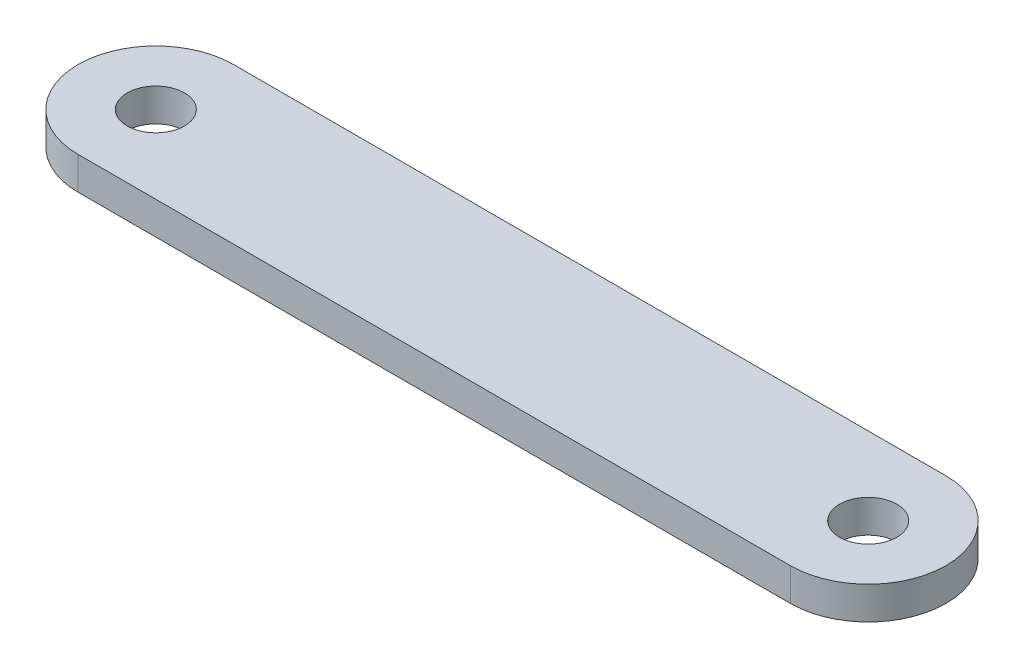
ISO-10303-21;
HEADER;
FILE_DESCRIPTION(('STEP AP214'),'2;1');
FILE_NAME('part.step','',(''),(''),'','','');
FILE_SCHEMA(('AUTOMOTIVE_DESIGN { 1 0 10303 214 1 1 1 1 }'));
ENDSEC;
DATA;
#1=APPLICATION_CONTEXT('core data for automotive mechanical design processes');
#2=APPLICATION_PROTOCOL_DEFINITION('international standard','automotive_design',2000,#1);
#3=PRODUCT_CONTEXT('',#1,'mechanical');
#4=PRODUCT('Part','Part','',(#3));
#5=PRODUCT_RELATED_PRODUCT_CATEGORY('part','',(#4));
#6=PRODUCT_DEFINITION_FORMATION('','',#4);
#7=PRODUCT_DEFINITION_CONTEXT('part definition',#1,'design');
#8=PRODUCT_DEFINITION('design','',#6,#7);
#9=PRODUCT_DEFINITION_SHAPE('','',#8);
#10=(LENGTH_UNIT() NAMED_UNIT(*) SI_UNIT(.MILLI.,.METRE.));
#11=(NAMED_UNIT(*) PLANE_ANGLE_UNIT() SI_UNIT($,.RADIAN.));
#12=(NAMED_UNIT(*) SI_UNIT($,.STERADIAN.) SOLID_ANGLE_UNIT());
#13=UNCERTAINTY_MEASURE_WITH_UNIT(LENGTH_MEASURE(1.E-05),#10,'distance_accuracy_value','');
#14=(GEOMETRIC_REPRESENTATION_CONTEXT(3) GLOBAL_UNCERTAINTY_ASSIGNED_CONTEXT((#13)) GLOBAL_UNIT_ASSIGNED_CONTEXT((#10,
#11,#12)) REPRESENTATION_CONTEXT('',''));
#15=CARTESIAN_POINT('',(0.,0.,0.));
#16=DIRECTION('',(0.,0.,1.));
#17=DIRECTION('',(1.,0.,0.));
#18=AXIS2_PLACEMENT_3D('',#15,#16,#17);
#19=CARTESIAN_POINT('',(0.,2.,0.));
#20=DIRECTION('',(0.,1.,0.));
#21=DIRECTION('',(0.,0.,1.));
#22=AXIS2_PLACEMENT_3D('',#19,#20,#21);
#23=PLANE('',#22);
#24=CARTESIAN_POINT('',(0.,2.,0.));
#25=DIRECTION('',(0.,1.,0.));
#26=DIRECTION('',(0.,0.,1.));
#27=AXIS2_PLACEMENT_3D('',#24,#25,#26);
#28=CIRCLE('',#27,1.75);
#29=CARTESIAN_POINT('',(0.,2.,1.75));
#30=VERTEX_POINT('',#29);
#31=EDGE_CURVE('E116',#30,#30,#28,.T.);
#32=ORIENTED_EDGE('',*,*,#31,.F.);
#33=EDGE_LOOP('',(#32));
#34=FACE_BOUND('',#33,.T.);
#35=CARTESIAN_POINT('',(0.,2.,0.));
#36=DIRECTION('',(0.,1.,0.));
#37=DIRECTION('',(0.,0.,1.));
#38=AXIS2_PLACEMENT_3D('',#35,#36,#37);
#39=CIRCLE('',#38,4.75);
#40=CARTESIAN_POINT('',(0.,2.,-4.75));
#41=VERTEX_POINT('',#40);
#42=CARTESIAN_POINT('',(0.,2.,4.75));
#43=VERTEX_POINT('',#42);
#44=EDGE_CURVE('E96',#41,#43,#39,.T.);
#45=ORIENTED_EDGE('',*,*,#44,.T.);
#46=DIRECTION('',(1.,0.,0.));
#47=VECTOR('',#46,1.);
#48=CARTESIAN_POINT('',(0.,2.,4.75));
#49=LINE('',#48,#47);
#50=CARTESIAN_POINT('',(43.5,2.,4.75));
#51=VERTEX_POINT('',#50);
#52=EDGE_CURVE('E91',#43,#51,#49,.T.);
#53=ORIENTED_EDGE('',*,*,#52,.T.);
#54=CARTESIAN_POINT('',(43.5,2.,0.));
#55=DIRECTION('',(0.,1.,0.));
#56=DIRECTION('',(0.,0.,1.));
#57=AXIS2_PLACEMENT_3D('',#54,#55,#56);
#58=CIRCLE('',#57,4.75);
#59=CARTESIAN_POINT('',(43.5,2.,-4.75));
#60=VERTEX_POINT('',#59);
#61=EDGE_CURVE('E94',#51,#60,#58,.T.);
#62=ORIENTED_EDGE('',*,*,#61,.T.);
#63=DIRECTION('',(-1.,0.,0.));
#64=VECTOR('',#63,1.);
#65=CARTESIAN_POINT('',(0.,2.,-4.75));
#66=LINE('',#65,#64);
#67=EDGE_CURVE('E61',#60,#41,#66,.T.);
#68=ORIENTED_EDGE('',*,*,#67,.T.);
#69=EDGE_LOOP('',(#45,#53,#62,#68));
#70=FACE_BOUND('',#69,.T.);
#71=CARTESIAN_POINT('',(43.5,2.,0.));
#72=DIRECTION('',(0.,1.,0.));
#73=DIRECTION('',(0.,0.,1.));
#74=AXIS2_PLACEMENT_3D('',#71,#72,#73);
#75=CIRCLE('',#74,1.75);
#76=CARTESIAN_POINT('',(43.5,2.,1.75));
#77=VERTEX_POINT('',#76);
#78=EDGE_CURVE('E138',#77,#77,#75,.T.);
#79=ORIENTED_EDGE('',*,*,#78,.F.);
#80=EDGE_LOOP('',(#79));
#81=FACE_BOUND('',#80,.T.);
#82=ADVANCED_FACE('F43',(#34,#70,#81),#23,.T.);
#83=CARTESIAN_POINT('',(0.,0.,0.));
#84=DIRECTION('',(0.,1.,0.));
#85=DIRECTION('',(0.,0.,1.));
#86=AXIS2_PLACEMENT_3D('',#83,#84,#85);
#87=PLANE('',#86);
#88=CARTESIAN_POINT('',(0.,0.,0.));
#89=DIRECTION('',(0.,1.,0.));
#90=DIRECTION('',(0.,0.,1.));
#91=AXIS2_PLACEMENT_3D('',#88,#89,#90);
#92=CIRCLE('',#91,4.75);
#93=CARTESIAN_POINT('',(0.,0.,-4.75));
#94=VERTEX_POINT('',#93);
#95=CARTESIAN_POINT('',(0.,0.,4.75));
#96=VERTEX_POINT('',#95);
#97=EDGE_CURVE('E112',#94,#96,#92,.T.);
#98=ORIENTED_EDGE('',*,*,#97,.F.);
#99=DIRECTION('',(-1.,0.,0.));
#100=VECTOR('',#99,1.);
#101=CARTESIAN_POINT('',(0.,0.,-4.75));
#102=LINE('',#101,#100);
#103=CARTESIAN_POINT('',(43.5,0.,-4.75));
#104=VERTEX_POINT('',#103);
#105=EDGE_CURVE('E84',#104,#94,#102,.T.);
#106=ORIENTED_EDGE('',*,*,#105,.F.);
#107=CARTESIAN_POINT('',(43.5,0.,0.));
#108=DIRECTION('',(0.,1.,0.));
#109=DIRECTION('',(0.,0.,1.));
#110=AXIS2_PLACEMENT_3D('',#107,#108,#109);
#111=CIRCLE('',#110,4.75);
#112=CARTESIAN_POINT('',(43.5,0.,4.75));
#113=VERTEX_POINT('',#112);
#114=EDGE_CURVE('E78',#113,#104,#111,.T.);
#115=ORIENTED_EDGE('',*,*,#114,.F.);
#116=DIRECTION('',(1.,0.,0.));
#117=VECTOR('',#116,1.);
#118=CARTESIAN_POINT('',(0.,0.,4.75));
#119=LINE('',#118,#117);
#120=EDGE_CURVE('E101',#96,#113,#119,.T.);
#121=ORIENTED_EDGE('',*,*,#120,.F.);
#122=EDGE_LOOP('',(#98,#106,#115,#121));
#123=FACE_BOUND('',#122,.T.);
#124=CARTESIAN_POINT('',(0.,0.,0.));
#125=DIRECTION('',(0.,1.,0.));
#126=DIRECTION('',(0.,0.,1.));
#127=AXIS2_PLACEMENT_3D('',#124,#125,#126);
#128=CIRCLE('',#127,1.75);
#129=CARTESIAN_POINT('',(0.,0.,1.75));
#130=VERTEX_POINT('',#129);
#131=EDGE_CURVE('E134',#130,#130,#128,.T.);
#132=ORIENTED_EDGE('',*,*,#131,.T.);
#133=EDGE_LOOP('',(#132));
#134=FACE_BOUND('',#133,.T.);
#135=CARTESIAN_POINT('',(43.5,0.,0.));
#136=DIRECTION('',(0.,1.,0.));
#137=DIRECTION('',(0.,0.,1.));
#138=AXIS2_PLACEMENT_3D('',#135,#136,#137);
#139=CIRCLE('',#138,1.75);
#140=CARTESIAN_POINT('',(43.5,0.,1.75));
#141=VERTEX_POINT('',#140);
#142=EDGE_CURVE('E142',#141,#141,#139,.T.);
#143=ORIENTED_EDGE('',*,*,#142,.T.);
#144=EDGE_LOOP('',(#143));
#145=FACE_BOUND('',#144,.T.);
#146=ADVANCED_FACE('F129',(#123,#134,#145),#87,.F.);
#147=CARTESIAN_POINT('',(0.,2.,0.));
#148=DIRECTION('',(0.,-1.,0.));
#149=DIRECTION('',(0.,0.,-1.));
#150=AXIS2_PLACEMENT_3D('',#147,#148,#149);
#151=CYLINDRICAL_SURFACE('',#150,4.75);
#152=ORIENTED_EDGE('',*,*,#97,.T.);
#153=DIRECTION('',(0.,-1.,0.));
#154=VECTOR('',#153,1.);
#155=CARTESIAN_POINT('',(0.,2.,4.75));
#156=LINE('',#155,#154);
#157=EDGE_CURVE('E11',#43,#96,#156,.T.);
#158=ORIENTED_EDGE('',*,*,#157,.F.);
#159=ORIENTED_EDGE('',*,*,#44,.F.);
#160=DIRECTION('',(0.,-1.,0.));
#161=VECTOR('',#160,1.);
#162=CARTESIAN_POINT('',(0.,2.,-4.75));
#163=LINE('',#162,#161);
#164=EDGE_CURVE('E108',#41,#94,#163,.T.);
#165=ORIENTED_EDGE('',*,*,#164,.T.);
#166=EDGE_LOOP('',(#152,#158,#159,#165));
#167=FACE_BOUND('',#166,.T.);
#168=ADVANCED_FACE('F45',(#167),#151,.T.);
#169=CARTESIAN_POINT('',(0.,2.,4.75));
#170=DIRECTION('',(0.,0.,-1.));
#171=DIRECTION('',(-1.,0.,0.));
#172=AXIS2_PLACEMENT_3D('',#169,#170,#171);
#173=PLANE('',#172);
#174=ORIENTED_EDGE('',*,*,#120,.T.);
#175=DIRECTION('',(0.,-1.,0.));
#176=VECTOR('',#175,1.);
#177=CARTESIAN_POINT('',(43.5,2.,4.75));
#178=LINE('',#177,#176);
#179=EDGE_CURVE('E53',#51,#113,#178,.T.);
#180=ORIENTED_EDGE('',*,*,#179,.F.);
#181=ORIENTED_EDGE('',*,*,#52,.F.);
#182=ORIENTED_EDGE('',*,*,#157,.T.);
#183=EDGE_LOOP('',(#174,#180,#181,#182));
#184=FACE_BOUND('',#183,.T.);
#185=ADVANCED_FACE('F100',(#184),#173,.F.);
#186=CARTESIAN_POINT('',(43.5,2.,0.));
#187=DIRECTION('',(0.,-1.,0.));
#188=DIRECTION('',(0.,0.,-1.));
#189=AXIS2_PLACEMENT_3D('',#186,#187,#188);
#190=CYLINDRICAL_SURFACE('',#189,4.75);
#191=ORIENTED_EDGE('',*,*,#114,.T.);
#192=DIRECTION('',(0.,-1.,0.));
#193=VECTOR('',#192,1.);
#194=CARTESIAN_POINT('',(43.5,2.,-4.75));
#195=LINE('',#194,#193);
#196=EDGE_CURVE('E103',#60,#104,#195,.T.);
#197=ORIENTED_EDGE('',*,*,#196,.F.);
#198=ORIENTED_EDGE('',*,*,#61,.F.);
#199=ORIENTED_EDGE('',*,*,#179,.T.);
#200=EDGE_LOOP('',(#191,#197,#198,#199));
#201=FACE_BOUND('',#200,.T.);
#202=ADVANCED_FACE('F104',(#201),#190,.T.);
#203=CARTESIAN_POINT('',(0.,2.,-4.75));
#204=DIRECTION('',(0.,0.,1.));
#205=DIRECTION('',(1.,0.,0.));
#206=AXIS2_PLACEMENT_3D('',#203,#204,#205);
#207=PLANE('',#206);
#208=ORIENTED_EDGE('',*,*,#105,.T.);
#209=ORIENTED_EDGE('',*,*,#164,.F.);
#210=ORIENTED_EDGE('',*,*,#67,.F.);
#211=ORIENTED_EDGE('',*,*,#196,.T.);
#212=EDGE_LOOP('',(#208,#209,#210,#211));
#213=FACE_BOUND('',#212,.T.);
#214=ADVANCED_FACE('F126',(#213),#207,.F.);
#215=CARTESIAN_POINT('',(0.,2.,0.));
#216=DIRECTION('',(0.,-1.,0.));
#217=DIRECTION('',(0.,0.,-1.));
#218=AXIS2_PLACEMENT_3D('',#215,#216,#217);
#219=CYLINDRICAL_SURFACE('',#218,1.75);
#220=ORIENTED_EDGE('',*,*,#31,.T.);
#221=EDGE_LOOP('',(#220));
#222=FACE_BOUND('',#221,.T.);
#223=ORIENTED_EDGE('',*,*,#131,.F.);
#224=EDGE_LOOP('',(#223));
#225=FACE_BOUND('',#224,.T.);
#226=ADVANCED_FACE('F161',(#222,#225),#219,.F.);
#227=CARTESIAN_POINT('',(43.5,2.,0.));
#228=DIRECTION('',(0.,-1.,0.));
#229=DIRECTION('',(0.,0.,-1.));
#230=AXIS2_PLACEMENT_3D('',#227,#228,#229);
#231=CYLINDRICAL_SURFACE('',#230,1.75);
#232=ORIENTED_EDGE('',*,*,#78,.T.);
#233=EDGE_LOOP('',(#232));
#234=FACE_BOUND('',#233,.T.);
#235=ORIENTED_EDGE('',*,*,#142,.F.);
#236=EDGE_LOOP('',(#235));
#237=FACE_BOUND('',#236,.T.);
#238=ADVANCED_FACE('F150',(#234,#237),#231,.F.);
#239=CLOSED_SHELL('',(#82,#146,#168,#185,#202,#214,#226,#238));
#240=MANIFOLD_SOLID_BREP('B2',#239);
#241=ADVANCED_BREP_SHAPE_REPRESENTATION('',(#18,#240),#14);
#242=SHAPE_DEFINITION_REPRESENTATION(#9,#241);
ENDSEC;
END-ISO-10303-21;
